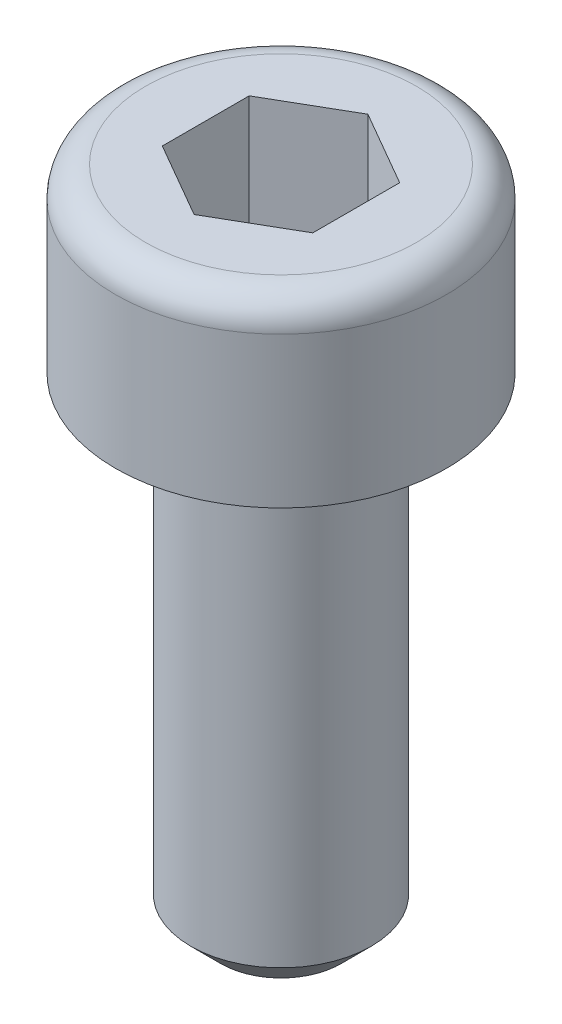
ISO-10303-21;
HEADER;
FILE_DESCRIPTION(('STEP AP214'),'2;1');
FILE_NAME('part.step','',(''),(''),'','','');
FILE_SCHEMA(('AUTOMOTIVE_DESIGN { 1 0 10303 214 1 1 1 1 }'));
ENDSEC;
DATA;
#1=APPLICATION_CONTEXT('core data for automotive mechanical design processes');
#2=APPLICATION_PROTOCOL_DEFINITION('international standard','automotive_design',2000,#1);
#3=PRODUCT_CONTEXT('',#1,'mechanical');
#4=PRODUCT('Part','Part','',(#3));
#5=PRODUCT_RELATED_PRODUCT_CATEGORY('part','',(#4));
#6=PRODUCT_DEFINITION_FORMATION('','',#4);
#7=PRODUCT_DEFINITION_CONTEXT('part definition',#1,'design');
#8=PRODUCT_DEFINITION('design','',#6,#7);
#9=PRODUCT_DEFINITION_SHAPE('','',#8);
#10=(LENGTH_UNIT() NAMED_UNIT(*) SI_UNIT(.MILLI.,.METRE.));
#11=(NAMED_UNIT(*) PLANE_ANGLE_UNIT() SI_UNIT($,.RADIAN.));
#12=(NAMED_UNIT(*) SI_UNIT($,.STERADIAN.) SOLID_ANGLE_UNIT());
#13=UNCERTAINTY_MEASURE_WITH_UNIT(LENGTH_MEASURE(1.E-05),#10,'distance_accuracy_value','');
#14=(GEOMETRIC_REPRESENTATION_CONTEXT(3) GLOBAL_UNCERTAINTY_ASSIGNED_CONTEXT((#13)) GLOBAL_UNIT_ASSIGNED_CONTEXT((#10,
#11,#12)) REPRESENTATION_CONTEXT('',''));
#15=CARTESIAN_POINT('',(0.,0.,0.));
#16=DIRECTION('',(0.,0.,1.));
#17=DIRECTION('',(1.,0.,0.));
#18=AXIS2_PLACEMENT_3D('',#15,#16,#17);
#19=CARTESIAN_POINT('',(0.,0.,0.));
#20=DIRECTION('',(0.,-1.,0.));
#21=DIRECTION('',(0.,0.,-1.));
#22=AXIS2_PLACEMENT_3D('',#19,#20,#21);
#23=PLANE('',#22);
#24=CARTESIAN_POINT('',(0.,0.,0.));
#25=DIRECTION('',(0.,-1.,0.));
#26=DIRECTION('',(0.,0.,-1.));
#27=AXIS2_PLACEMENT_3D('',#24,#25,#26);
#28=CIRCLE('',#27,2.25);
#29=CARTESIAN_POINT('',(0.,0.,-2.25));
#30=VERTEX_POINT('',#29);
#31=EDGE_CURVE('E44',#30,#30,#28,.F.);
#32=ORIENTED_EDGE('',*,*,#31,.T.);
#33=EDGE_LOOP('',(#32));
#34=FACE_BOUND('',#33,.T.);
#35=DIRECTION('',(-0.866025403784439,0.,-0.5));
#36=VECTOR('',#35,1.);
#37=CARTESIAN_POINT('',(1.25,0.,-0.721687836487032));
#38=LINE('',#37,#36);
#39=CARTESIAN_POINT('',(1.25,0.,-0.721687836487032));
#40=VERTEX_POINT('',#39);
#41=CARTESIAN_POINT('',(0.,0.,-1.44337567297406));
#42=VERTEX_POINT('',#41);
#43=EDGE_CURVE('E125',#40,#42,#38,.T.);
#44=ORIENTED_EDGE('',*,*,#43,.F.);
#45=DIRECTION('',(0.,0.,-1.));
#46=VECTOR('',#45,1.);
#47=CARTESIAN_POINT('',(1.25,0.,0.721687836487033));
#48=LINE('',#47,#46);
#49=CARTESIAN_POINT('',(1.25,0.,0.721687836487033));
#50=VERTEX_POINT('',#49);
#51=EDGE_CURVE('E51',#50,#40,#48,.T.);
#52=ORIENTED_EDGE('',*,*,#51,.F.);
#53=DIRECTION('',(0.866025403784439,0.,-0.5));
#54=VECTOR('',#53,1.);
#55=CARTESIAN_POINT('',(0.,0.,1.44337567297406));
#56=LINE('',#55,#54);
#57=CARTESIAN_POINT('',(0.,0.,1.44337567297406));
#58=VERTEX_POINT('',#57);
#59=EDGE_CURVE('E134',#58,#50,#56,.T.);
#60=ORIENTED_EDGE('',*,*,#59,.F.);
#61=DIRECTION('',(0.866025403784439,0.,0.5));
#62=VECTOR('',#61,1.);
#63=CARTESIAN_POINT('',(-1.25,0.,0.721687836487031));
#64=LINE('',#63,#62);
#65=CARTESIAN_POINT('',(-1.25,0.,0.721687836487031));
#66=VERTEX_POINT('',#65);
#67=EDGE_CURVE('E132',#66,#58,#64,.T.);
#68=ORIENTED_EDGE('',*,*,#67,.F.);
#69=DIRECTION('',(0.,0.,1.));
#70=VECTOR('',#69,1.);
#71=CARTESIAN_POINT('',(-1.25,0.,-0.721687836487033));
#72=LINE('',#71,#70);
#73=CARTESIAN_POINT('',(-1.25,0.,-0.721687836487033));
#74=VERTEX_POINT('',#73);
#75=EDGE_CURVE('E99',#74,#66,#72,.T.);
#76=ORIENTED_EDGE('',*,*,#75,.F.);
#77=DIRECTION('',(-0.866025403784439,0.,0.5));
#78=VECTOR('',#77,1.);
#79=CARTESIAN_POINT('',(0.,0.,-1.44337567297406));
#80=LINE('',#79,#78);
#81=EDGE_CURVE('E128',#42,#74,#80,.T.);
#82=ORIENTED_EDGE('',*,*,#81,.F.);
#83=EDGE_LOOP('',(#44,#52,#60,#68,#76,#82));
#84=FACE_BOUND('',#83,.T.);
#85=ADVANCED_FACE('F36',(#34,#84),#23,.F.);
#86=CARTESIAN_POINT('',(0.,0.,0.));
#87=DIRECTION('',(0.,1.,0.));
#88=DIRECTION('',(0.,0.,1.));
#89=AXIS2_PLACEMENT_3D('',#86,#87,#88);
#90=CYLINDRICAL_SURFACE('',#89,2.75);
#91=CARTESIAN_POINT('',(0.,-0.5,0.));
#92=DIRECTION('',(0.,-1.,0.));
#93=DIRECTION('',(0.,0.,-1.));
#94=AXIS2_PLACEMENT_3D('',#91,#92,#93);
#95=CIRCLE('',#94,2.75);
#96=CARTESIAN_POINT('',(0.,-0.5,-2.75));
#97=VERTEX_POINT('',#96);
#98=EDGE_CURVE('E11',#97,#97,#95,.T.);
#99=ORIENTED_EDGE('',*,*,#98,.T.);
#100=EDGE_LOOP('',(#99));
#101=FACE_BOUND('',#100,.T.);
#102=CARTESIAN_POINT('',(0.,-3.,0.));
#103=DIRECTION('',(0.,1.,0.));
#104=DIRECTION('',(0.,0.,1.));
#105=AXIS2_PLACEMENT_3D('',#102,#103,#104);
#106=CIRCLE('',#105,2.75);
#107=CARTESIAN_POINT('',(0.,-3.,2.75));
#108=VERTEX_POINT('',#107);
#109=EDGE_CURVE('E146',#108,#108,#106,.T.);
#110=ORIENTED_EDGE('',*,*,#109,.T.);
#111=EDGE_LOOP('',(#110));
#112=FACE_BOUND('',#111,.T.);
#113=ADVANCED_FACE('F168',(#101,#112),#90,.T.);
#114=CARTESIAN_POINT('',(2.75,-3.,0.));
#115=DIRECTION('',(0.,1.,0.));
#116=DIRECTION('',(0.,0.,1.));
#117=AXIS2_PLACEMENT_3D('',#114,#115,#116);
#118=PLANE('',#117);
#119=ORIENTED_EDGE('',*,*,#109,.F.);
#120=EDGE_LOOP('',(#119));
#121=FACE_BOUND('',#120,.T.);
#122=CARTESIAN_POINT('',(0.,-3.,0.));
#123=DIRECTION('',(0.,1.,0.));
#124=DIRECTION('',(0.,0.,1.));
#125=AXIS2_PLACEMENT_3D('',#122,#123,#124);
#126=CIRCLE('',#125,1.5);
#127=CARTESIAN_POINT('',(0.,-3.,1.5));
#128=VERTEX_POINT('',#127);
#129=EDGE_CURVE('E138',#128,#128,#126,.T.);
#130=ORIENTED_EDGE('',*,*,#129,.T.);
#131=EDGE_LOOP('',(#130));
#132=FACE_BOUND('',#131,.T.);
#133=ADVANCED_FACE('F173',(#121,#132),#118,.F.);
#134=CARTESIAN_POINT('',(0.,0.,0.));
#135=DIRECTION('',(0.,1.,0.));
#136=DIRECTION('',(0.,0.,1.));
#137=AXIS2_PLACEMENT_3D('',#134,#135,#136);
#138=CYLINDRICAL_SURFACE('',#137,1.5);
#139=CARTESIAN_POINT('',(0.,-10.5,0.));
#140=DIRECTION('',(0.,1.,0.));
#141=DIRECTION('',(0.,0.,1.));
#142=AXIS2_PLACEMENT_3D('',#139,#140,#141);
#143=CIRCLE('',#142,1.5);
#144=CARTESIAN_POINT('',(0.,-10.5,1.5));
#145=VERTEX_POINT('',#144);
#146=EDGE_CURVE('E149',#145,#145,#143,.T.);
#147=ORIENTED_EDGE('',*,*,#146,.T.);
#148=EDGE_LOOP('',(#147));
#149=FACE_BOUND('',#148,.T.);
#150=ORIENTED_EDGE('',*,*,#129,.F.);
#151=EDGE_LOOP('',(#150));
#152=FACE_BOUND('',#151,.T.);
#153=ADVANCED_FACE('F179',(#149,#152),#138,.T.);
#154=CARTESIAN_POINT('',(1.5,-11.,0.));
#155=DIRECTION('',(0.,1.,0.));
#156=DIRECTION('',(0.,0.,1.));
#157=AXIS2_PLACEMENT_3D('',#154,#155,#156);
#158=PLANE('',#157);
#159=CARTESIAN_POINT('',(0.,-11.,0.));
#160=DIRECTION('',(0.,1.,0.));
#161=DIRECTION('',(0.,0.,1.));
#162=AXIS2_PLACEMENT_3D('',#159,#160,#161);
#163=CIRCLE('',#162,1.);
#164=CARTESIAN_POINT('',(0.,-11.,1.));
#165=VERTEX_POINT('',#164);
#166=EDGE_CURVE('E152',#165,#165,#163,.F.);
#167=ORIENTED_EDGE('',*,*,#166,.T.);
#168=EDGE_LOOP('',(#167));
#169=FACE_BOUND('',#168,.T.);
#170=ADVANCED_FACE('F183',(#169),#158,.F.);
#171=CARTESIAN_POINT('',(1.25,-2.,0.721687836487033));
#172=DIRECTION('',(1.,0.,0.));
#173=DIRECTION('',(0.,0.,-1.));
#174=AXIS2_PLACEMENT_3D('',#171,#172,#173);
#175=PLANE('',#174);
#176=ORIENTED_EDGE('',*,*,#51,.T.);
#177=DIRECTION('',(0.,1.,0.));
#178=VECTOR('',#177,1.);
#179=CARTESIAN_POINT('',(1.25,-2.,-0.721687836487032));
#180=LINE('',#179,#178);
#181=CARTESIAN_POINT('',(1.25,-2.,-0.721687836487032));
#182=VERTEX_POINT('',#181);
#183=EDGE_CURVE('E81',#182,#40,#180,.T.);
#184=ORIENTED_EDGE('',*,*,#183,.F.);
#185=DIRECTION('',(0.,0.,-1.));
#186=VECTOR('',#185,1.);
#187=CARTESIAN_POINT('',(1.25,-2.,0.721687836487033));
#188=LINE('',#187,#186);
#189=CARTESIAN_POINT('',(1.25,-2.,0.721687836487033));
#190=VERTEX_POINT('',#189);
#191=EDGE_CURVE('E136',#190,#182,#188,.T.);
#192=ORIENTED_EDGE('',*,*,#191,.F.);
#193=DIRECTION('',(0.,1.,0.));
#194=VECTOR('',#193,1.);
#195=CARTESIAN_POINT('',(1.25,-2.,0.721687836487033));
#196=LINE('',#195,#194);
#197=EDGE_CURVE('E59',#190,#50,#196,.T.);
#198=ORIENTED_EDGE('',*,*,#197,.T.);
#199=EDGE_LOOP('',(#176,#184,#192,#198));
#200=FACE_BOUND('',#199,.T.);
#201=ADVANCED_FACE('F187',(#200),#175,.F.);
#202=CARTESIAN_POINT('',(0.,-2.,1.44337567297406));
#203=DIRECTION('',(0.5,0.,0.866025403784439));
#204=DIRECTION('',(0.866025403784439,0.,-0.5));
#205=AXIS2_PLACEMENT_3D('',#202,#203,#204);
#206=PLANE('',#205);
#207=ORIENTED_EDGE('',*,*,#59,.T.);
#208=ORIENTED_EDGE('',*,*,#197,.F.);
#209=DIRECTION('',(0.866025403784439,0.,-0.5));
#210=VECTOR('',#209,1.);
#211=CARTESIAN_POINT('',(0.,-2.,1.44337567297406));
#212=LINE('',#211,#210);
#213=CARTESIAN_POINT('',(0.,-2.,1.44337567297406));
#214=VERTEX_POINT('',#213);
#215=EDGE_CURVE('E111',#214,#190,#212,.T.);
#216=ORIENTED_EDGE('',*,*,#215,.F.);
#217=DIRECTION('',(0.,1.,0.));
#218=VECTOR('',#217,1.);
#219=CARTESIAN_POINT('',(0.,-2.,1.44337567297406));
#220=LINE('',#219,#218);
#221=EDGE_CURVE('E103',#214,#58,#220,.T.);
#222=ORIENTED_EDGE('',*,*,#221,.T.);
#223=EDGE_LOOP('',(#207,#208,#216,#222));
#224=FACE_BOUND('',#223,.T.);
#225=ADVANCED_FACE('F191',(#224),#206,.F.);
#226=CARTESIAN_POINT('',(-1.25,-2.,0.721687836487031));
#227=DIRECTION('',(-0.5,0.,0.866025403784439));
#228=DIRECTION('',(0.866025403784439,0.,0.5));
#229=AXIS2_PLACEMENT_3D('',#226,#227,#228);
#230=PLANE('',#229);
#231=ORIENTED_EDGE('',*,*,#67,.T.);
#232=ORIENTED_EDGE('',*,*,#221,.F.);
#233=DIRECTION('',(0.866025403784439,0.,0.5));
#234=VECTOR('',#233,1.);
#235=CARTESIAN_POINT('',(-1.25,-2.,0.721687836487031));
#236=LINE('',#235,#234);
#237=CARTESIAN_POINT('',(-1.25,-2.,0.721687836487031));
#238=VERTEX_POINT('',#237);
#239=EDGE_CURVE('E107',#238,#214,#236,.T.);
#240=ORIENTED_EDGE('',*,*,#239,.F.);
#241=DIRECTION('',(0.,1.,0.));
#242=VECTOR('',#241,1.);
#243=CARTESIAN_POINT('',(-1.25,-2.,0.721687836487031));
#244=LINE('',#243,#242);
#245=EDGE_CURVE('E92',#238,#66,#244,.T.);
#246=ORIENTED_EDGE('',*,*,#245,.T.);
#247=EDGE_LOOP('',(#231,#232,#240,#246));
#248=FACE_BOUND('',#247,.T.);
#249=ADVANCED_FACE('F108',(#248),#230,.F.);
#250=CARTESIAN_POINT('',(-1.25,-2.,-0.721687836487033));
#251=DIRECTION('',(-1.,0.,0.));
#252=DIRECTION('',(0.,0.,1.));
#253=AXIS2_PLACEMENT_3D('',#250,#251,#252);
#254=PLANE('',#253);
#255=ORIENTED_EDGE('',*,*,#75,.T.);
#256=ORIENTED_EDGE('',*,*,#245,.F.);
#257=DIRECTION('',(0.,0.,1.));
#258=VECTOR('',#257,1.);
#259=CARTESIAN_POINT('',(-1.25,-2.,-0.721687836487033));
#260=LINE('',#259,#258);
#261=CARTESIAN_POINT('',(-1.25,-2.,-0.721687836487033));
#262=VERTEX_POINT('',#261);
#263=EDGE_CURVE('E96',#262,#238,#260,.T.);
#264=ORIENTED_EDGE('',*,*,#263,.F.);
#265=DIRECTION('',(0.,1.,0.));
#266=VECTOR('',#265,1.);
#267=CARTESIAN_POINT('',(-1.25,-2.,-0.721687836487033));
#268=LINE('',#267,#266);
#269=EDGE_CURVE('E104',#262,#74,#268,.T.);
#270=ORIENTED_EDGE('',*,*,#269,.T.);
#271=EDGE_LOOP('',(#255,#256,#264,#270));
#272=FACE_BOUND('',#271,.T.);
#273=ADVANCED_FACE('F94',(#272),#254,.F.);
#274=CARTESIAN_POINT('',(0.,-2.,-1.44337567297406));
#275=DIRECTION('',(-0.5,0.,-0.866025403784439));
#276=DIRECTION('',(-0.866025403784439,0.,0.5));
#277=AXIS2_PLACEMENT_3D('',#274,#275,#276);
#278=PLANE('',#277);
#279=ORIENTED_EDGE('',*,*,#81,.T.);
#280=ORIENTED_EDGE('',*,*,#269,.F.);
#281=DIRECTION('',(-0.866025403784439,0.,0.5));
#282=VECTOR('',#281,1.);
#283=CARTESIAN_POINT('',(0.,-2.,-1.44337567297406));
#284=LINE('',#283,#282);
#285=CARTESIAN_POINT('',(0.,-2.,-1.44337567297406));
#286=VERTEX_POINT('',#285);
#287=EDGE_CURVE('E117',#286,#262,#284,.T.);
#288=ORIENTED_EDGE('',*,*,#287,.F.);
#289=DIRECTION('',(0.,1.,0.));
#290=VECTOR('',#289,1.);
#291=CARTESIAN_POINT('',(0.,-2.,-1.44337567297406));
#292=LINE('',#291,#290);
#293=EDGE_CURVE('E141',#286,#42,#292,.T.);
#294=ORIENTED_EDGE('',*,*,#293,.T.);
#295=EDGE_LOOP('',(#279,#280,#288,#294));
#296=FACE_BOUND('',#295,.T.);
#297=ADVANCED_FACE('F195',(#296),#278,.F.);
#298=CARTESIAN_POINT('',(1.25,-2.,-0.721687836487032));
#299=DIRECTION('',(0.5,0.,-0.866025403784439));
#300=DIRECTION('',(-0.866025403784439,0.,-0.5));
#301=AXIS2_PLACEMENT_3D('',#298,#299,#300);
#302=PLANE('',#301);
#303=ORIENTED_EDGE('',*,*,#43,.T.);
#304=ORIENTED_EDGE('',*,*,#293,.F.);
#305=DIRECTION('',(-0.866025403784439,0.,-0.5));
#306=VECTOR('',#305,1.);
#307=CARTESIAN_POINT('',(1.25,-2.,-0.721687836487032));
#308=LINE('',#307,#306);
#309=EDGE_CURVE('E119',#182,#286,#308,.T.);
#310=ORIENTED_EDGE('',*,*,#309,.F.);
#311=ORIENTED_EDGE('',*,*,#183,.T.);
#312=EDGE_LOOP('',(#303,#304,#310,#311));
#313=FACE_BOUND('',#312,.T.);
#314=ADVANCED_FACE('F192',(#313),#302,.F.);
#315=CARTESIAN_POINT('',(1.25,-2.,-0.721687836487032));
#316=DIRECTION('',(0.,1.,0.));
#317=DIRECTION('',(0.,0.,1.));
#318=AXIS2_PLACEMENT_3D('',#315,#316,#317);
#319=PLANE('',#318);
#320=ORIENTED_EDGE('',*,*,#191,.T.);
#321=ORIENTED_EDGE('',*,*,#309,.T.);
#322=ORIENTED_EDGE('',*,*,#287,.T.);
#323=ORIENTED_EDGE('',*,*,#263,.T.);
#324=ORIENTED_EDGE('',*,*,#239,.T.);
#325=ORIENTED_EDGE('',*,*,#215,.T.);
#326=EDGE_LOOP('',(#320,#321,#322,#323,#324,#325));
#327=FACE_BOUND('',#326,.T.);
#328=ADVANCED_FACE('F114',(#327),#319,.T.);
#329=CARTESIAN_POINT('',(0.,-10.5,0.));
#330=DIRECTION('',(0.,1.,0.));
#331=DIRECTION('',(0.,0.,1.));
#332=AXIS2_PLACEMENT_3D('',#329,#330,#331);
#333=CONICAL_SURFACE('',#332,1.5,0.785398163397449);
#334=ORIENTED_EDGE('',*,*,#166,.F.);
#335=EDGE_LOOP('',(#334));
#336=FACE_BOUND('',#335,.T.);
#337=ORIENTED_EDGE('',*,*,#146,.F.);
#338=EDGE_LOOP('',(#337));
#339=FACE_BOUND('',#338,.T.);
#340=ADVANCED_FACE('F160',(#336,#339),#333,.T.);
#341=CARTESIAN_POINT('',(0.,-0.5,0.));
#342=DIRECTION('',(0.,-1.,0.));
#343=DIRECTION('',(0.,0.,-1.));
#344=AXIS2_PLACEMENT_3D('',#341,#342,#343);
#345=TOROIDAL_SURFACE('',#344,2.25,0.5);
#346=ORIENTED_EDGE('',*,*,#98,.F.);
#347=EDGE_LOOP('',(#346));
#348=FACE_BOUND('',#347,.T.);
#349=ORIENTED_EDGE('',*,*,#31,.F.);
#350=EDGE_LOOP('',(#349));
#351=FACE_BOUND('',#350,.T.);
#352=ADVANCED_FACE('F38',(#348,#351),#345,.T.);
#353=CLOSED_SHELL('',(#85,#113,#133,#153,#170,#201,#225,#249,#273,#297,#314,#328,#340,#352));
#354=MANIFOLD_SOLID_BREP('B2',#353);
#355=ADVANCED_BREP_SHAPE_REPRESENTATION('',(#18,#354),#14);
#356=SHAPE_DEFINITION_REPRESENTATION(#9,#355);
ENDSEC;
END-ISO-10303-21;
